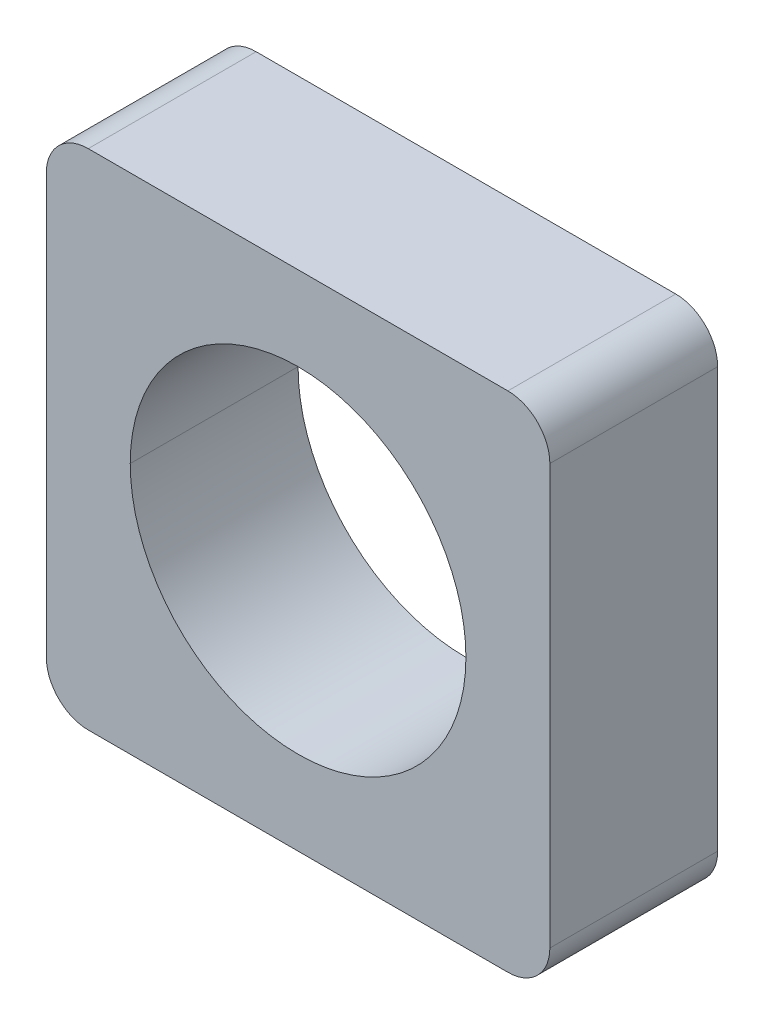
ISO-10303-21;
HEADER;
FILE_DESCRIPTION(('STEP AP214'),'2;1');
FILE_NAME('part.step','',(''),(''),'','','');
FILE_SCHEMA(('AUTOMOTIVE_DESIGN { 1 0 10303 214 1 1 1 1 }'));
ENDSEC;
DATA;
#1=APPLICATION_CONTEXT('core data for automotive mechanical design processes');
#2=APPLICATION_PROTOCOL_DEFINITION('international standard','automotive_design',2000,#1);
#3=PRODUCT_CONTEXT('',#1,'mechanical');
#4=PRODUCT('Part','Part','',(#3));
#5=PRODUCT_RELATED_PRODUCT_CATEGORY('part','',(#4));
#6=PRODUCT_DEFINITION_FORMATION('','',#4);
#7=PRODUCT_DEFINITION_CONTEXT('part definition',#1,'design');
#8=PRODUCT_DEFINITION('design','',#6,#7);
#9=PRODUCT_DEFINITION_SHAPE('','',#8);
#10=(LENGTH_UNIT() NAMED_UNIT(*) SI_UNIT(.MILLI.,.METRE.));
#11=(NAMED_UNIT(*) PLANE_ANGLE_UNIT() SI_UNIT($,.RADIAN.));
#12=(NAMED_UNIT(*) SI_UNIT($,.STERADIAN.) SOLID_ANGLE_UNIT());
#13=UNCERTAINTY_MEASURE_WITH_UNIT(LENGTH_MEASURE(1.E-05),#10,'distance_accuracy_value','');
#14=(GEOMETRIC_REPRESENTATION_CONTEXT(3) GLOBAL_UNCERTAINTY_ASSIGNED_CONTEXT((#13)) GLOBAL_UNIT_ASSIGNED_CONTEXT((#10,
#11,#12)) REPRESENTATION_CONTEXT('',''));
#15=CARTESIAN_POINT('',(0.,0.,0.));
#16=DIRECTION('',(0.,0.,1.));
#17=DIRECTION('',(1.,0.,0.));
#18=AXIS2_PLACEMENT_3D('',#15,#16,#17);
#19=CARTESIAN_POINT('',(-6.,6.,0.));
#20=DIRECTION('',(-1.,0.,0.));
#21=DIRECTION('',(0.,0.,1.));
#22=AXIS2_PLACEMENT_3D('',#19,#20,#21);
#23=PLANE('',#22);
#24=DIRECTION('',(0.,-1.,0.));
#25=VECTOR('',#24,1.);
#26=CARTESIAN_POINT('',(-6.,5.,0.));
#27=LINE('',#26,#25);
#28=CARTESIAN_POINT('',(-6.,5.,0.));
#29=VERTEX_POINT('',#28);
#30=CARTESIAN_POINT('',(-6.,-5.,0.));
#31=VERTEX_POINT('',#30);
#32=EDGE_CURVE('E20',#29,#31,#27,.T.);
#33=ORIENTED_EDGE('',*,*,#32,.T.);
#34=DIRECTION('',(0.,0.,-1.));
#35=VECTOR('',#34,1.);
#36=CARTESIAN_POINT('',(-6.,-5.,4.));
#37=LINE('',#36,#35);
#38=CARTESIAN_POINT('',(-6.,-5.,4.));
#39=VERTEX_POINT('',#38);
#40=EDGE_CURVE('E11',#39,#31,#37,.T.);
#41=ORIENTED_EDGE('',*,*,#40,.F.);
#42=DIRECTION('',(0.,-1.,0.));
#43=VECTOR('',#42,1.);
#44=CARTESIAN_POINT('',(-6.,5.,4.));
#45=LINE('',#44,#43);
#46=CARTESIAN_POINT('',(-6.,5.,4.));
#47=VERTEX_POINT('',#46);
#48=EDGE_CURVE('E175',#47,#39,#45,.T.);
#49=ORIENTED_EDGE('',*,*,#48,.F.);
#50=DIRECTION('',(0.,0.,-1.));
#51=VECTOR('',#50,1.);
#52=CARTESIAN_POINT('',(-6.,5.,4.));
#53=LINE('',#52,#51);
#54=EDGE_CURVE('E114',#47,#29,#53,.T.);
#55=ORIENTED_EDGE('',*,*,#54,.T.);
#56=EDGE_LOOP('',(#33,#41,#49,#55));
#57=FACE_BOUND('',#56,.T.);
#58=ADVANCED_FACE('F17',(#57),#23,.T.);
#59=CARTESIAN_POINT('',(-5.,-5.,9.2144));
#60=DIRECTION('',(0.,0.,-1.));
#61=DIRECTION('',(0.,-1.,0.));
#62=AXIS2_PLACEMENT_3D('',#59,#60,#61);
#63=CYLINDRICAL_SURFACE('',#62,1.);
#64=DIRECTION('',(0.,0.,-1.));
#65=VECTOR('',#64,1.);
#66=CARTESIAN_POINT('',(-5.,-6.,4.));
#67=LINE('',#66,#65);
#68=CARTESIAN_POINT('',(-5.,-6.,4.));
#69=VERTEX_POINT('',#68);
#70=CARTESIAN_POINT('',(-5.,-6.,0.));
#71=VERTEX_POINT('',#70);
#72=EDGE_CURVE('E27',#69,#71,#67,.T.);
#73=ORIENTED_EDGE('',*,*,#72,.F.);
#74=CARTESIAN_POINT('',(-5.,-5.,4.));
#75=DIRECTION('',(0.,0.,1.));
#76=DIRECTION('',(-1.,0.,0.));
#77=AXIS2_PLACEMENT_3D('',#74,#75,#76);
#78=CIRCLE('',#77,1.);
#79=EDGE_CURVE('E179',#39,#69,#78,.T.);
#80=ORIENTED_EDGE('',*,*,#79,.F.);
#81=ORIENTED_EDGE('',*,*,#40,.T.);
#82=CARTESIAN_POINT('',(-5.,-5.,0.));
#83=DIRECTION('',(0.,0.,-1.));
#84=DIRECTION('',(0.,-1.,0.));
#85=AXIS2_PLACEMENT_3D('',#82,#83,#84);
#86=CIRCLE('',#85,1.);
#87=EDGE_CURVE('E144',#71,#31,#86,.T.);
#88=ORIENTED_EDGE('',*,*,#87,.F.);
#89=EDGE_LOOP('',(#73,#80,#81,#88));
#90=FACE_BOUND('',#89,.T.);
#91=ADVANCED_FACE('F145',(#90),#63,.T.);
#92=CARTESIAN_POINT('',(-6.,-6.,0.));
#93=DIRECTION('',(0.,-1.,0.));
#94=DIRECTION('',(0.,0.,-1.));
#95=AXIS2_PLACEMENT_3D('',#92,#93,#94);
#96=PLANE('',#95);
#97=DIRECTION('',(1.,0.,0.));
#98=VECTOR('',#97,1.);
#99=CARTESIAN_POINT('',(-5.,-6.,0.));
#100=LINE('',#99,#98);
#101=CARTESIAN_POINT('',(5.,-6.,0.));
#102=VERTEX_POINT('',#101);
#103=EDGE_CURVE('E135',#71,#102,#100,.T.);
#104=ORIENTED_EDGE('',*,*,#103,.T.);
#105=DIRECTION('',(0.,0.,-1.));
#106=VECTOR('',#105,1.);
#107=CARTESIAN_POINT('',(5.,-6.,4.));
#108=LINE('',#107,#106);
#109=CARTESIAN_POINT('',(5.,-6.,4.));
#110=VERTEX_POINT('',#109);
#111=EDGE_CURVE('E125',#110,#102,#108,.T.);
#112=ORIENTED_EDGE('',*,*,#111,.F.);
#113=DIRECTION('',(1.,0.,0.));
#114=VECTOR('',#113,1.);
#115=CARTESIAN_POINT('',(-5.,-6.,4.));
#116=LINE('',#115,#114);
#117=EDGE_CURVE('E138',#69,#110,#116,.T.);
#118=ORIENTED_EDGE('',*,*,#117,.F.);
#119=ORIENTED_EDGE('',*,*,#72,.T.);
#120=EDGE_LOOP('',(#104,#112,#118,#119));
#121=FACE_BOUND('',#120,.T.);
#122=ADVANCED_FACE('F133',(#121),#96,.T.);
#123=CARTESIAN_POINT('',(5.,-5.,9.2144));
#124=DIRECTION('',(0.,0.,-1.));
#125=DIRECTION('',(1.,0.,0.));
#126=AXIS2_PLACEMENT_3D('',#123,#124,#125);
#127=CYLINDRICAL_SURFACE('',#126,1.);
#128=DIRECTION('',(0.,0.,-1.));
#129=VECTOR('',#128,1.);
#130=CARTESIAN_POINT('',(6.,-5.,4.));
#131=LINE('',#130,#129);
#132=CARTESIAN_POINT('',(6.,-5.,4.));
#133=VERTEX_POINT('',#132);
#134=CARTESIAN_POINT('',(6.,-5.,0.));
#135=VERTEX_POINT('',#134);
#136=EDGE_CURVE('E208',#133,#135,#131,.T.);
#137=ORIENTED_EDGE('',*,*,#136,.F.);
#138=CARTESIAN_POINT('',(5.,-5.,4.));
#139=DIRECTION('',(0.,0.,1.));
#140=DIRECTION('',(0.,-1.,0.));
#141=AXIS2_PLACEMENT_3D('',#138,#139,#140);
#142=CIRCLE('',#141,1.);
#143=EDGE_CURVE('E210',#110,#133,#142,.T.);
#144=ORIENTED_EDGE('',*,*,#143,.F.);
#145=ORIENTED_EDGE('',*,*,#111,.T.);
#146=CARTESIAN_POINT('',(5.,-5.,0.));
#147=DIRECTION('',(0.,0.,-1.));
#148=DIRECTION('',(1.,0.,0.));
#149=AXIS2_PLACEMENT_3D('',#146,#147,#148);
#150=CIRCLE('',#149,1.);
#151=EDGE_CURVE('E153',#135,#102,#150,.T.);
#152=ORIENTED_EDGE('',*,*,#151,.F.);
#153=EDGE_LOOP('',(#137,#144,#145,#152));
#154=FACE_BOUND('',#153,.T.);
#155=ADVANCED_FACE('F265',(#154),#127,.T.);
#156=CARTESIAN_POINT('',(6.,-6.,0.));
#157=DIRECTION('',(1.,0.,0.));
#158=DIRECTION('',(0.,1.,0.));
#159=AXIS2_PLACEMENT_3D('',#156,#157,#158);
#160=PLANE('',#159);
#161=DIRECTION('',(0.,1.,0.));
#162=VECTOR('',#161,1.);
#163=CARTESIAN_POINT('',(6.,-5.,4.));
#164=LINE('',#163,#162);
#165=CARTESIAN_POINT('',(6.,5.,4.));
#166=VERTEX_POINT('',#165);
#167=EDGE_CURVE('E186',#133,#166,#164,.T.);
#168=ORIENTED_EDGE('',*,*,#167,.F.);
#169=ORIENTED_EDGE('',*,*,#136,.T.);
#170=DIRECTION('',(0.,1.,0.));
#171=VECTOR('',#170,1.);
#172=CARTESIAN_POINT('',(6.,-5.,0.));
#173=LINE('',#172,#171);
#174=CARTESIAN_POINT('',(6.,5.,0.));
#175=VERTEX_POINT('',#174);
#176=EDGE_CURVE('E160',#135,#175,#173,.T.);
#177=ORIENTED_EDGE('',*,*,#176,.T.);
#178=DIRECTION('',(0.,0.,-1.));
#179=VECTOR('',#178,1.);
#180=CARTESIAN_POINT('',(6.,5.,4.));
#181=LINE('',#180,#179);
#182=EDGE_CURVE('E207',#166,#175,#181,.T.);
#183=ORIENTED_EDGE('',*,*,#182,.F.);
#184=EDGE_LOOP('',(#168,#169,#177,#183));
#185=FACE_BOUND('',#184,.T.);
#186=ADVANCED_FACE('F277',(#185),#160,.T.);
#187=CARTESIAN_POINT('',(5.,5.,9.2144));
#188=DIRECTION('',(0.,0.,-1.));
#189=DIRECTION('',(0.,1.,0.));
#190=AXIS2_PLACEMENT_3D('',#187,#188,#189);
#191=CYLINDRICAL_SURFACE('',#190,1.);
#192=DIRECTION('',(0.,0.,-1.));
#193=VECTOR('',#192,1.);
#194=CARTESIAN_POINT('',(5.,6.,4.));
#195=LINE('',#194,#193);
#196=CARTESIAN_POINT('',(5.,6.,4.));
#197=VERTEX_POINT('',#196);
#198=CARTESIAN_POINT('',(5.,6.,0.));
#199=VERTEX_POINT('',#198);
#200=EDGE_CURVE('E197',#197,#199,#195,.T.);
#201=ORIENTED_EDGE('',*,*,#200,.F.);
#202=CARTESIAN_POINT('',(5.,5.,4.));
#203=DIRECTION('',(0.,0.,1.));
#204=DIRECTION('',(1.,0.,0.));
#205=AXIS2_PLACEMENT_3D('',#202,#203,#204);
#206=CIRCLE('',#205,1.);
#207=EDGE_CURVE('E181',#166,#197,#206,.T.);
#208=ORIENTED_EDGE('',*,*,#207,.F.);
#209=ORIENTED_EDGE('',*,*,#182,.T.);
#210=CARTESIAN_POINT('',(5.,5.,0.));
#211=DIRECTION('',(0.,0.,-1.));
#212=DIRECTION('',(0.,1.,0.));
#213=AXIS2_PLACEMENT_3D('',#210,#211,#212);
#214=CIRCLE('',#213,1.);
#215=EDGE_CURVE('E173',#199,#175,#214,.T.);
#216=ORIENTED_EDGE('',*,*,#215,.F.);
#217=EDGE_LOOP('',(#201,#208,#209,#216));
#218=FACE_BOUND('',#217,.T.);
#219=ADVANCED_FACE('F281',(#218),#191,.T.);
#220=CARTESIAN_POINT('',(6.,6.,0.));
#221=DIRECTION('',(0.,1.,0.));
#222=DIRECTION('',(1.,0.,0.));
#223=AXIS2_PLACEMENT_3D('',#220,#221,#222);
#224=PLANE('',#223);
#225=DIRECTION('',(-1.,0.,0.));
#226=VECTOR('',#225,1.);
#227=CARTESIAN_POINT('',(5.,6.,4.));
#228=LINE('',#227,#226);
#229=CARTESIAN_POINT('',(-5.,6.,4.));
#230=VERTEX_POINT('',#229);
#231=EDGE_CURVE('E185',#197,#230,#228,.T.);
#232=ORIENTED_EDGE('',*,*,#231,.F.);
#233=ORIENTED_EDGE('',*,*,#200,.T.);
#234=DIRECTION('',(-1.,0.,0.));
#235=VECTOR('',#234,1.);
#236=CARTESIAN_POINT('',(5.,6.,0.));
#237=LINE('',#236,#235);
#238=CARTESIAN_POINT('',(-5.,6.,0.));
#239=VERTEX_POINT('',#238);
#240=EDGE_CURVE('E171',#199,#239,#237,.T.);
#241=ORIENTED_EDGE('',*,*,#240,.T.);
#242=DIRECTION('',(0.,0.,-1.));
#243=VECTOR('',#242,1.);
#244=CARTESIAN_POINT('',(-5.,6.,4.));
#245=LINE('',#244,#243);
#246=EDGE_CURVE('E41',#230,#239,#245,.T.);
#247=ORIENTED_EDGE('',*,*,#246,.F.);
#248=EDGE_LOOP('',(#232,#233,#241,#247));
#249=FACE_BOUND('',#248,.T.);
#250=ADVANCED_FACE('F268',(#249),#224,.T.);
#251=CARTESIAN_POINT('',(-5.,5.,9.2144));
#252=DIRECTION('',(0.,0.,-1.));
#253=DIRECTION('',(-1.,0.,0.));
#254=AXIS2_PLACEMENT_3D('',#251,#252,#253);
#255=CYLINDRICAL_SURFACE('',#254,1.);
#256=ORIENTED_EDGE('',*,*,#54,.F.);
#257=CARTESIAN_POINT('',(-5.,5.,4.));
#258=DIRECTION('',(0.,0.,1.));
#259=DIRECTION('',(0.,1.,0.));
#260=AXIS2_PLACEMENT_3D('',#257,#258,#259);
#261=CIRCLE('',#260,1.);
#262=EDGE_CURVE('E192',#230,#47,#261,.T.);
#263=ORIENTED_EDGE('',*,*,#262,.F.);
#264=ORIENTED_EDGE('',*,*,#246,.T.);
#265=CARTESIAN_POINT('',(-5.,5.,0.));
#266=DIRECTION('',(0.,0.,-1.));
#267=DIRECTION('',(-1.,0.,0.));
#268=AXIS2_PLACEMENT_3D('',#265,#266,#267);
#269=CIRCLE('',#268,1.);
#270=EDGE_CURVE('E214',#29,#239,#269,.T.);
#271=ORIENTED_EDGE('',*,*,#270,.F.);
#272=EDGE_LOOP('',(#256,#263,#264,#271));
#273=FACE_BOUND('',#272,.T.);
#274=ADVANCED_FACE('F254',(#273),#255,.T.);
#275=CARTESIAN_POINT('',(0.,0.,4.));
#276=DIRECTION('',(0.,0.,1.));
#277=DIRECTION('',(1.,0.,0.));
#278=AXIS2_PLACEMENT_3D('',#275,#276,#277);
#279=PLANE('',#278);
#280=CARTESIAN_POINT('',(0.,0.,4.));
#281=DIRECTION('',(0.,0.,-1.));
#282=DIRECTION('',(-1.,0.,0.));
#283=AXIS2_PLACEMENT_3D('',#280,#281,#282);
#284=CIRCLE('',#283,4.);
#285=CARTESIAN_POINT('',(-4.,0.,4.));
#286=VERTEX_POINT('',#285);
#287=CARTESIAN_POINT('',(4.,0.,4.));
#288=VERTEX_POINT('',#287);
#289=EDGE_CURVE('E180',#286,#288,#284,.T.);
#290=ORIENTED_EDGE('',*,*,#289,.T.);
#291=CARTESIAN_POINT('',(0.,0.,4.));
#292=DIRECTION('',(0.,0.,-1.));
#293=DIRECTION('',(1.,0.,0.));
#294=AXIS2_PLACEMENT_3D('',#291,#292,#293);
#295=CIRCLE('',#294,4.);
#296=EDGE_CURVE('E169',#288,#286,#295,.T.);
#297=ORIENTED_EDGE('',*,*,#296,.T.);
#298=EDGE_LOOP('',(#290,#297));
#299=FACE_BOUND('',#298,.T.);
#300=ORIENTED_EDGE('',*,*,#48,.T.);
#301=ORIENTED_EDGE('',*,*,#79,.T.);
#302=ORIENTED_EDGE('',*,*,#117,.T.);
#303=ORIENTED_EDGE('',*,*,#143,.T.);
#304=ORIENTED_EDGE('',*,*,#167,.T.);
#305=ORIENTED_EDGE('',*,*,#207,.T.);
#306=ORIENTED_EDGE('',*,*,#231,.T.);
#307=ORIENTED_EDGE('',*,*,#262,.T.);
#308=EDGE_LOOP('',(#300,#301,#302,#303,#304,#305,#306,#307));
#309=FACE_BOUND('',#308,.T.);
#310=ADVANCED_FACE('F252',(#299,#309),#279,.T.);
#311=CARTESIAN_POINT('',(0.,0.,0.));
#312=DIRECTION('',(0.,0.,1.));
#313=DIRECTION('',(1.,0.,0.));
#314=AXIS2_PLACEMENT_3D('',#311,#312,#313);
#315=CYLINDRICAL_SURFACE('',#314,4.);
#316=DIRECTION('',(0.,0.,1.));
#317=VECTOR('',#316,1.);
#318=CARTESIAN_POINT('',(4.,0.,0.));
#319=LINE('',#318,#317);
#320=CARTESIAN_POINT('',(4.,0.,0.));
#321=VERTEX_POINT('',#320);
#322=EDGE_CURVE('E164',#321,#288,#319,.T.);
#323=ORIENTED_EDGE('',*,*,#322,.T.);
#324=ORIENTED_EDGE('',*,*,#289,.F.);
#325=DIRECTION('',(0.,0.,1.));
#326=VECTOR('',#325,1.);
#327=CARTESIAN_POINT('',(-4.,0.,0.));
#328=LINE('',#327,#326);
#329=CARTESIAN_POINT('',(-4.,0.,0.));
#330=VERTEX_POINT('',#329);
#331=EDGE_CURVE('E166',#330,#286,#328,.T.);
#332=ORIENTED_EDGE('',*,*,#331,.F.);
#333=CARTESIAN_POINT('',(0.,0.,0.));
#334=DIRECTION('',(0.,0.,-1.));
#335=DIRECTION('',(-1.,0.,0.));
#336=AXIS2_PLACEMENT_3D('',#333,#334,#335);
#337=CIRCLE('',#336,4.);
#338=EDGE_CURVE('E217',#330,#321,#337,.T.);
#339=ORIENTED_EDGE('',*,*,#338,.T.);
#340=EDGE_LOOP('',(#323,#324,#332,#339));
#341=FACE_BOUND('',#340,.T.);
#342=ADVANCED_FACE('F246',(#341),#315,.F.);
#343=CARTESIAN_POINT('',(0.,0.,0.));
#344=DIRECTION('',(0.,0.,1.));
#345=DIRECTION('',(1.,0.,0.));
#346=AXIS2_PLACEMENT_3D('',#343,#344,#345);
#347=CYLINDRICAL_SURFACE('',#346,4.);
#348=ORIENTED_EDGE('',*,*,#331,.T.);
#349=ORIENTED_EDGE('',*,*,#296,.F.);
#350=ORIENTED_EDGE('',*,*,#322,.F.);
#351=CARTESIAN_POINT('',(0.,0.,0.));
#352=DIRECTION('',(0.,0.,-1.));
#353=DIRECTION('',(1.,0.,0.));
#354=AXIS2_PLACEMENT_3D('',#351,#352,#353);
#355=CIRCLE('',#354,4.);
#356=EDGE_CURVE('E170',#321,#330,#355,.T.);
#357=ORIENTED_EDGE('',*,*,#356,.T.);
#358=EDGE_LOOP('',(#348,#349,#350,#357));
#359=FACE_BOUND('',#358,.T.);
#360=ADVANCED_FACE('F251',(#359),#347,.F.);
#361=CARTESIAN_POINT('',(0.,0.,0.));
#362=DIRECTION('',(0.,0.,1.));
#363=DIRECTION('',(1.,0.,0.));
#364=AXIS2_PLACEMENT_3D('',#361,#362,#363);
#365=PLANE('',#364);
#366=ORIENTED_EDGE('',*,*,#338,.F.);
#367=ORIENTED_EDGE('',*,*,#356,.F.);
#368=EDGE_LOOP('',(#366,#367));
#369=FACE_BOUND('',#368,.T.);
#370=ORIENTED_EDGE('',*,*,#240,.F.);
#371=ORIENTED_EDGE('',*,*,#215,.T.);
#372=ORIENTED_EDGE('',*,*,#176,.F.);
#373=ORIENTED_EDGE('',*,*,#151,.T.);
#374=ORIENTED_EDGE('',*,*,#103,.F.);
#375=ORIENTED_EDGE('',*,*,#87,.T.);
#376=ORIENTED_EDGE('',*,*,#32,.F.);
#377=ORIENTED_EDGE('',*,*,#270,.T.);
#378=EDGE_LOOP('',(#370,#371,#372,#373,#374,#375,#376,#377));
#379=FACE_BOUND('',#378,.T.);
#380=ADVANCED_FACE('F151',(#369,#379),#365,.F.);
#381=CLOSED_SHELL('',(#58,#91,#122,#155,#186,#219,#250,#274,#310,#342,#360,#380));
#382=MANIFOLD_SOLID_BREP('B1',#381);
#383=ADVANCED_BREP_SHAPE_REPRESENTATION('',(#18,#382),#14);
#384=SHAPE_DEFINITION_REPRESENTATION(#9,#383);
ENDSEC;
END-ISO-10303-21;
